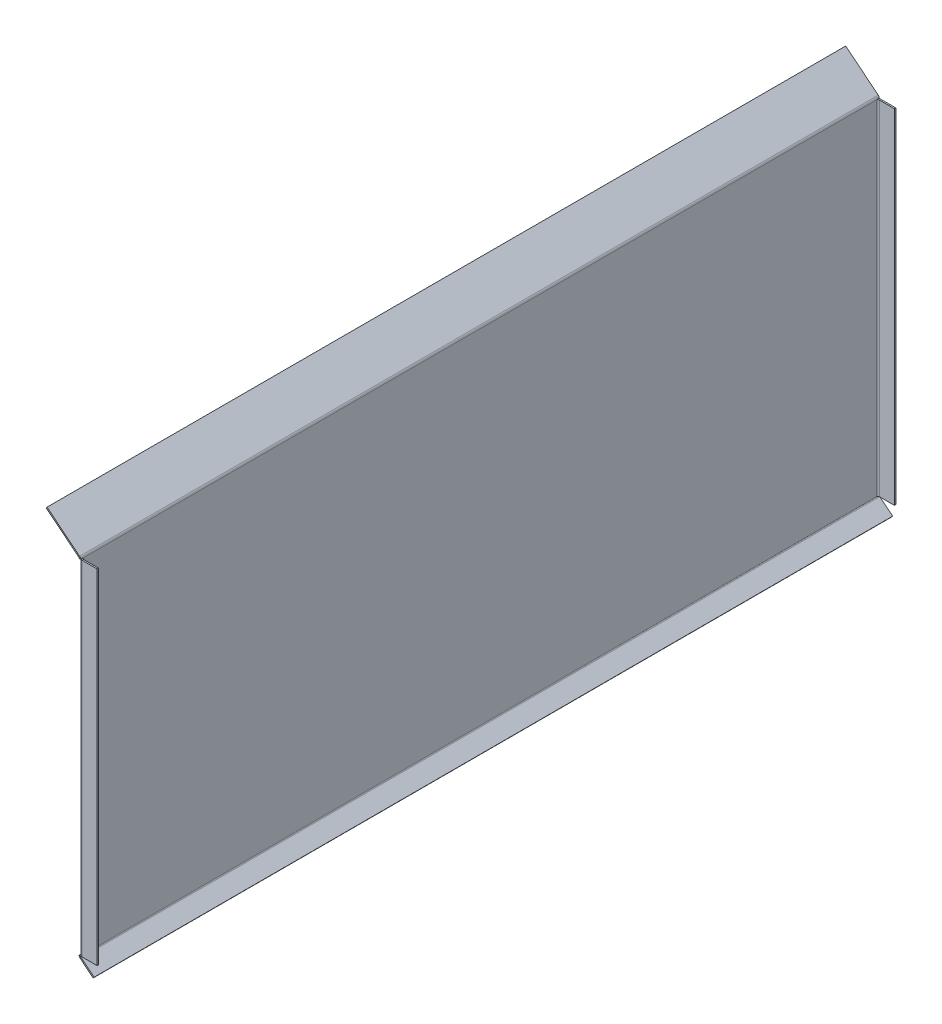
ISO-10303-21;
HEADER;
FILE_DESCRIPTION(('STEP AP214'),'2;1');
FILE_NAME('part.step','',(''),(''),'','','');
FILE_SCHEMA(('AUTOMOTIVE_DESIGN { 1 0 10303 214 1 1 1 1 }'));
ENDSEC;
DATA;
#1=APPLICATION_CONTEXT('core data for automotive mechanical design processes');
#2=APPLICATION_PROTOCOL_DEFINITION('international standard','automotive_design',2000,#1);
#3=PRODUCT_CONTEXT('',#1,'mechanical');
#4=PRODUCT('Part','Part','',(#3));
#5=PRODUCT_RELATED_PRODUCT_CATEGORY('part','',(#4));
#6=PRODUCT_DEFINITION_FORMATION('','',#4);
#7=PRODUCT_DEFINITION_CONTEXT('part definition',#1,'design');
#8=PRODUCT_DEFINITION('design','',#6,#7);
#9=PRODUCT_DEFINITION_SHAPE('','',#8);
#10=(LENGTH_UNIT() NAMED_UNIT(*) SI_UNIT(.MILLI.,.METRE.));
#11=(NAMED_UNIT(*) PLANE_ANGLE_UNIT() SI_UNIT($,.RADIAN.));
#12=(NAMED_UNIT(*) SI_UNIT($,.STERADIAN.) SOLID_ANGLE_UNIT());
#13=UNCERTAINTY_MEASURE_WITH_UNIT(LENGTH_MEASURE(1.E-05),#10,'distance_accuracy_value','');
#14=(GEOMETRIC_REPRESENTATION_CONTEXT(3) GLOBAL_UNCERTAINTY_ASSIGNED_CONTEXT((#13)) GLOBAL_UNIT_ASSIGNED_CONTEXT((#10,
#11,#12)) REPRESENTATION_CONTEXT('',''));
#15=CARTESIAN_POINT('',(0.,0.,0.));
#16=DIRECTION('',(0.,0.,1.));
#17=DIRECTION('',(1.,0.,0.));
#18=AXIS2_PLACEMENT_3D('',#15,#16,#17);
#19=CARTESIAN_POINT('',(-1.59594559789866E-13,-345.308695969271,-780.522727272728));
#20=DIRECTION('',(0.,1.,0.));
#21=DIRECTION('',(0.,0.,1.));
#22=AXIS2_PLACEMENT_3D('',#19,#20,#21);
#23=PLANE('',#22);
#24=DIRECTION('',(0.,0.,-1.));
#25=VECTOR('',#24,1.);
#26=CARTESIAN_POINT('',(-4.00000000000009,-345.308695969271,-788.522727272728));
#27=LINE('',#26,#25);
#28=CARTESIAN_POINT('',(-4.00000000000009,-345.308695969271,-788.522727272728));
#29=VERTEX_POINT('',#28);
#30=CARTESIAN_POINT('',(-4.00000000000009,-345.308695969271,-780.522727272728));
#31=VERTEX_POINT('',#30);
#32=EDGE_CURVE('E453',#29,#31,#27,.F.);
#33=ORIENTED_EDGE('',*,*,#32,.T.);
#34=CARTESIAN_POINT('',(3.99999999999984,-345.308695969271,-780.522727272728));
#35=DIRECTION('',(0.,1.,0.));
#36=DIRECTION('',(-1.,0.,0.));
#37=AXIS2_PLACEMENT_3D('',#34,#35,#36);
#38=CIRCLE('',#37,8.);
#39=CARTESIAN_POINT('',(0.,-345.308695969271,-787.450930503003));
#40=VERTEX_POINT('',#39);
#41=EDGE_CURVE('E137',#31,#40,#38,.F.);
#42=ORIENTED_EDGE('',*,*,#41,.T.);
#43=DIRECTION('',(0.,0.,-1.));
#44=VECTOR('',#43,1.);
#45=CARTESIAN_POINT('',(0.,-345.308695969271,-788.522727272728));
#46=LINE('',#45,#44);
#47=CARTESIAN_POINT('',(0.,-345.308695969271,-788.522727272728));
#48=VERTEX_POINT('',#47);
#49=EDGE_CURVE('E466',#48,#40,#46,.F.);
#50=ORIENTED_EDGE('',*,*,#49,.F.);
#51=DIRECTION('',(-1.,0.,0.));
#52=VECTOR('',#51,1.);
#53=CARTESIAN_POINT('',(0.,-345.308695969271,-788.522727272728));
#54=LINE('',#53,#52);
#55=EDGE_CURVE('E459',#48,#29,#54,.T.);
#56=ORIENTED_EDGE('',*,*,#55,.T.);
#57=EDGE_LOOP('',(#33,#42,#50,#56));
#58=FACE_BOUND('',#57,.T.);
#59=ADVANCED_FACE('F119',(#58),#23,.T.);
#60=CARTESIAN_POINT('',(0.,609.581423241998,-788.522727272728));
#61=DIRECTION('',(0.,-1.,0.));
#62=DIRECTION('',(0.,0.,-1.));
#63=AXIS2_PLACEMENT_3D('',#60,#61,#62);
#64=PLANE('',#63);
#65=DIRECTION('',(0.,0.,-1.));
#66=VECTOR('',#65,1.);
#67=CARTESIAN_POINT('',(0.,609.581423241998,-788.522727272728));
#68=LINE('',#67,#66);
#69=CARTESIAN_POINT('',(0.,609.581423241998,-788.522727272728));
#70=VERTEX_POINT('',#69);
#71=CARTESIAN_POINT('',(0.,609.581423241998,-787.450930503003));
#72=VERTEX_POINT('',#71);
#73=EDGE_CURVE('E507',#70,#72,#68,.F.);
#74=ORIENTED_EDGE('',*,*,#73,.T.);
#75=CARTESIAN_POINT('',(4.00000000000005,609.581423241998,-780.522727272728));
#76=DIRECTION('',(0.,1.,0.));
#77=DIRECTION('',(-1.,0.,0.));
#78=AXIS2_PLACEMENT_3D('',#75,#76,#77);
#79=CIRCLE('',#78,8.);
#80=CARTESIAN_POINT('',(-3.99999999999991,609.581423241998,-780.522727272728));
#81=VERTEX_POINT('',#80);
#82=EDGE_CURVE('E13',#72,#81,#79,.T.);
#83=ORIENTED_EDGE('',*,*,#82,.T.);
#84=DIRECTION('',(0.,0.,-1.));
#85=VECTOR('',#84,1.);
#86=CARTESIAN_POINT('',(-3.99999999999991,609.581423241998,-788.522727272728));
#87=LINE('',#86,#85);
#88=CARTESIAN_POINT('',(-3.99999999999991,609.581423241998,-788.522727272728));
#89=VERTEX_POINT('',#88);
#90=EDGE_CURVE('E519',#89,#81,#87,.F.);
#91=ORIENTED_EDGE('',*,*,#90,.F.);
#92=DIRECTION('',(1.,0.,0.));
#93=VECTOR('',#92,1.);
#94=CARTESIAN_POINT('',(-3.99999999999991,609.581423241998,-788.522727272728));
#95=LINE('',#94,#93);
#96=EDGE_CURVE('E123',#89,#70,#95,.T.);
#97=ORIENTED_EDGE('',*,*,#96,.T.);
#98=EDGE_LOOP('',(#74,#83,#91,#97));
#99=FACE_BOUND('',#98,.T.);
#100=ADVANCED_FACE('F533',(#99),#64,.T.);
#101=CARTESIAN_POINT('',(-4.,0.,0.));
#102=DIRECTION('',(-1.,0.,0.));
#103=DIRECTION('',(0.,0.,1.));
#104=AXIS2_PLACEMENT_3D('',#101,#102,#103);
#105=PLANE('',#104);
#106=CARTESIAN_POINT('',(-3.99999999999991,609.581423241998,1423.47727272727));
#107=VERTEX_POINT('',#106);
#108=EDGE_CURVE('E522',#81,#107,#87,.F.);
#109=ORIENTED_EDGE('',*,*,#108,.F.);
#110=DIRECTION('',(0.,1.,0.));
#111=VECTOR('',#110,1.);
#112=CARTESIAN_POINT('',(-3.99999999999995,609.581423241998,-780.522727272728));
#113=LINE('',#112,#111);
#114=EDGE_CURVE('E304',#81,#31,#113,.F.);
#115=ORIENTED_EDGE('',*,*,#114,.T.);
#116=CARTESIAN_POINT('',(-3.99999999999986,-345.308695969271,1423.47727272727));
#117=VERTEX_POINT('',#116);
#118=EDGE_CURVE('E456',#31,#117,#27,.F.);
#119=ORIENTED_EDGE('',*,*,#118,.T.);
#120=DIRECTION('',(0.,-1.,0.));
#121=VECTOR('',#120,1.);
#122=CARTESIAN_POINT('',(-4.,-345.308695969271,1423.47727272727));
#123=LINE('',#122,#121);
#124=EDGE_CURVE('E391',#117,#107,#123,.F.);
#125=ORIENTED_EDGE('',*,*,#124,.T.);
#126=EDGE_LOOP('',(#109,#115,#119,#125));
#127=FACE_BOUND('',#126,.T.);
#128=ADVANCED_FACE('F579',(#127),#105,.T.);
#129=CARTESIAN_POINT('',(0.,0.,0.));
#130=DIRECTION('',(-1.,0.,0.));
#131=DIRECTION('',(0.,0.,1.));
#132=AXIS2_PLACEMENT_3D('',#129,#130,#131);
#133=PLANE('',#132);
#134=DIRECTION('',(0.,1.,0.));
#135=VECTOR('',#134,1.);
#136=CARTESIAN_POINT('',(0.,609.581423241998,-780.522727272728));
#137=LINE('',#136,#135);
#138=CARTESIAN_POINT('',(0.,609.581423241998,-780.522727272728));
#139=VERTEX_POINT('',#138);
#140=CARTESIAN_POINT('',(0.,-345.308695969271,-780.522727272728));
#141=VERTEX_POINT('',#140);
#142=EDGE_CURVE('E355',#139,#141,#137,.F.);
#143=ORIENTED_EDGE('',*,*,#142,.F.);
#144=CARTESIAN_POINT('',(0.,609.581423241998,1423.47727272727));
#145=VERTEX_POINT('',#144);
#146=EDGE_CURVE('E510',#139,#145,#68,.F.);
#147=ORIENTED_EDGE('',*,*,#146,.T.);
#148=DIRECTION('',(0.,-1.,0.));
#149=VECTOR('',#148,1.);
#150=CARTESIAN_POINT('',(0.,-345.308695969271,1423.47727272727));
#151=LINE('',#150,#149);
#152=CARTESIAN_POINT('',(0.,-345.308695969271,1423.47727272727));
#153=VERTEX_POINT('',#152);
#154=EDGE_CURVE('E405',#153,#145,#151,.F.);
#155=ORIENTED_EDGE('',*,*,#154,.F.);
#156=EDGE_CURVE('E469',#141,#153,#46,.F.);
#157=ORIENTED_EDGE('',*,*,#156,.F.);
#158=EDGE_LOOP('',(#143,#147,#155,#157));
#159=FACE_BOUND('',#158,.T.);
#160=ADVANCED_FACE('F121',(#159),#133,.F.);
#161=CARTESIAN_POINT('',(1.43114686768087E-13,-345.308695969271,1431.47727272727));
#162=DIRECTION('',(0.,1.,0.));
#163=DIRECTION('',(0.,0.,1.));
#164=AXIS2_PLACEMENT_3D('',#161,#162,#163);
#165=PLANE('',#164);
#166=DIRECTION('',(0.,0.,-1.));
#167=VECTOR('',#166,1.);
#168=CARTESIAN_POINT('',(1.43114686768087E-13,-345.308695969271,1431.47727272727));
#169=LINE('',#168,#167);
#170=CARTESIAN_POINT('',(1.43114686768087E-13,-345.308695969271,1431.47727272727));
#171=VERTEX_POINT('',#170);
#172=CARTESIAN_POINT('',(1.23940954395816E-13,-345.308695969271,1430.40547595755));
#173=VERTEX_POINT('',#172);
#174=EDGE_CURVE('E410',#171,#173,#169,.T.);
#175=ORIENTED_EDGE('',*,*,#174,.T.);
#176=CARTESIAN_POINT('',(4.,-345.308695969271,1423.47727272727));
#177=DIRECTION('',(0.,-1.,0.));
#178=DIRECTION('',(0.,0.,-1.));
#179=AXIS2_PLACEMENT_3D('',#176,#177,#178);
#180=CIRCLE('',#179,8.);
#181=EDGE_CURVE('E128',#173,#117,#180,.T.);
#182=ORIENTED_EDGE('',*,*,#181,.T.);
#183=DIRECTION('',(0.,0.,-1.));
#184=VECTOR('',#183,1.);
#185=CARTESIAN_POINT('',(-4.00000000000009,-345.308695969271,-788.522727272728));
#186=LINE('',#185,#184);
#187=CARTESIAN_POINT('',(-3.99999999999986,-345.308695969271,1431.47727272727));
#188=VERTEX_POINT('',#187);
#189=EDGE_CURVE('E413',#188,#117,#186,.T.);
#190=ORIENTED_EDGE('',*,*,#189,.F.);
#191=DIRECTION('',(-1.,0.,0.));
#192=VECTOR('',#191,1.);
#193=CARTESIAN_POINT('',(1.43114686768087E-13,-345.308695969271,1431.47727272727));
#194=LINE('',#193,#192);
#195=EDGE_CURVE('E472',#171,#188,#194,.T.);
#196=ORIENTED_EDGE('',*,*,#195,.F.);
#197=EDGE_LOOP('',(#175,#182,#190,#196));
#198=FACE_BOUND('',#197,.T.);
#199=ADVANCED_FACE('F625',(#198),#165,.T.);
#200=CARTESIAN_POINT('',(0.,609.581423241998,1423.47727272727));
#201=DIRECTION('',(0.,-1.,0.));
#202=DIRECTION('',(0.,0.,-1.));
#203=AXIS2_PLACEMENT_3D('',#200,#201,#202);
#204=PLANE('',#203);
#205=CARTESIAN_POINT('',(-3.99999999999991,609.581423241998,1431.47727272727));
#206=VERTEX_POINT('',#205);
#207=EDGE_CURVE('E523',#107,#206,#87,.F.);
#208=ORIENTED_EDGE('',*,*,#207,.F.);
#209=CARTESIAN_POINT('',(4.,609.581423241998,1423.47727272727));
#210=DIRECTION('',(0.,-1.,0.));
#211=DIRECTION('',(0.,0.,-1.));
#212=AXIS2_PLACEMENT_3D('',#209,#210,#211);
#213=CIRCLE('',#212,8.);
#214=CARTESIAN_POINT('',(0.,609.581423241998,1430.40547595755));
#215=VERTEX_POINT('',#214);
#216=EDGE_CURVE('E396',#107,#215,#213,.F.);
#217=ORIENTED_EDGE('',*,*,#216,.T.);
#218=DIRECTION('',(0.,0.,1.));
#219=VECTOR('',#218,1.);
#220=CARTESIAN_POINT('',(0.,609.581423241998,1423.47727272727));
#221=LINE('',#220,#219);
#222=CARTESIAN_POINT('',(0.,609.581423241998,1431.47727272727));
#223=VERTEX_POINT('',#222);
#224=EDGE_CURVE('E399',#215,#223,#221,.T.);
#225=ORIENTED_EDGE('',*,*,#224,.T.);
#226=DIRECTION('',(1.,0.,0.));
#227=VECTOR('',#226,1.);
#228=CARTESIAN_POINT('',(-3.99999999999991,609.581423241998,1431.47727272727));
#229=LINE('',#228,#227);
#230=EDGE_CURVE('E525',#206,#223,#229,.T.);
#231=ORIENTED_EDGE('',*,*,#230,.F.);
#232=EDGE_LOOP('',(#208,#217,#225,#231));
#233=FACE_BOUND('',#232,.T.);
#234=ADVANCED_FACE('F622',(#233),#204,.T.);
#235=CARTESIAN_POINT('',(-7.99999999999983,609.581423241998,1431.47727272727));
#236=DIRECTION('',(0.,0.,1.));
#237=DIRECTION('',(1.,0.,0.));
#238=AXIS2_PLACEMENT_3D('',#235,#236,#237);
#239=PLANE('',#238);
#240=DIRECTION('',(-0.629320391049841,-0.777145961456968,0.));
#241=VECTOR('',#240,1.);
#242=CARTESIAN_POINT('',(-2.96543687160124,615.798590933654,1431.47727272727));
#243=LINE('',#242,#241);
#244=CARTESIAN_POINT('',(-5.48271843580051,612.690007087826,1431.47727272727));
#245=VERTEX_POINT('',#244);
#246=CARTESIAN_POINT('',(-2.96543687160113,615.798590933654,1431.47727272727));
#247=VERTEX_POINT('',#246);
#248=EDGE_CURVE('E475',#245,#247,#243,.F.);
#249=ORIENTED_EDGE('',*,*,#248,.F.);
#250=CARTESIAN_POINT('',(-7.99999999999983,609.581423241998,1431.47727272727));
#251=DIRECTION('',(0.,0.,-1.));
#252=DIRECTION('',(-1.,0.,0.));
#253=AXIS2_PLACEMENT_3D('',#250,#251,#252);
#254=CIRCLE('',#253,3.99999999999993);
#255=EDGE_CURVE('E516',#206,#245,#254,.F.);
#256=ORIENTED_EDGE('',*,*,#255,.F.);
#257=ORIENTED_EDGE('',*,*,#230,.T.);
#258=CARTESIAN_POINT('',(-7.99999999999983,609.581423241998,1431.47727272727));
#259=DIRECTION('',(0.,0.,-1.));
#260=DIRECTION('',(-1.,0.,0.));
#261=AXIS2_PLACEMENT_3D('',#258,#259,#260);
#262=CIRCLE('',#261,7.99999999999993);
#263=EDGE_CURVE('E509',#223,#247,#262,.F.);
#264=ORIENTED_EDGE('',*,*,#263,.T.);
#265=EDGE_LOOP('',(#249,#256,#257,#264));
#266=FACE_BOUND('',#265,.T.);
#267=ADVANCED_FACE('F556',(#266),#239,.T.);
#268=CARTESIAN_POINT('',(-7.99999999999983,609.581423241998,-788.522727272728));
#269=DIRECTION('',(0.,0.,1.));
#270=DIRECTION('',(1.,0.,0.));
#271=AXIS2_PLACEMENT_3D('',#268,#269,#270);
#272=PLANE('',#271);
#273=CARTESIAN_POINT('',(-7.99999999999983,609.581423241998,-788.522727272728));
#274=DIRECTION('',(0.,0.,-1.));
#275=DIRECTION('',(-1.,0.,0.));
#276=AXIS2_PLACEMENT_3D('',#273,#274,#275);
#277=CIRCLE('',#276,3.99999999999993);
#278=CARTESIAN_POINT('',(-5.48271843580051,612.690007087826,-788.522727272728));
#279=VERTEX_POINT('',#278);
#280=EDGE_CURVE('E480',#279,#89,#277,.T.);
#281=ORIENTED_EDGE('',*,*,#280,.F.);
#282=DIRECTION('',(-0.629320391049841,-0.777145961456968,0.));
#283=VECTOR('',#282,1.);
#284=CARTESIAN_POINT('',(-5.48271843580046,612.690007087826,-788.522727272728));
#285=LINE('',#284,#283);
#286=CARTESIAN_POINT('',(-2.96543687160105,615.798590933654,-788.522727272728));
#287=VERTEX_POINT('',#286);
#288=EDGE_CURVE('E500',#279,#287,#285,.F.);
#289=ORIENTED_EDGE('',*,*,#288,.T.);
#290=CARTESIAN_POINT('',(-7.99999999999983,609.581423241998,-788.522727272728));
#291=DIRECTION('',(0.,0.,-1.));
#292=DIRECTION('',(-1.,0.,0.));
#293=AXIS2_PLACEMENT_3D('',#290,#291,#292);
#294=CIRCLE('',#293,7.99999999999993);
#295=EDGE_CURVE('E513',#287,#70,#294,.T.);
#296=ORIENTED_EDGE('',*,*,#295,.T.);
#297=ORIENTED_EDGE('',*,*,#96,.F.);
#298=EDGE_LOOP('',(#281,#289,#296,#297));
#299=FACE_BOUND('',#298,.T.);
#300=ADVANCED_FACE('F537',(#299),#272,.F.);
#301=CARTESIAN_POINT('',(-7.99999999999983,609.581423241998,-788.522727272728));
#302=DIRECTION('',(0.,0.,-1.));
#303=DIRECTION('',(0.629320391049841,0.777145961456968,0.));
#304=AXIS2_PLACEMENT_3D('',#301,#302,#303);
#305=CYLINDRICAL_SURFACE('',#304,7.99999999999993);
#306=ORIENTED_EDGE('',*,*,#73,.F.);
#307=ORIENTED_EDGE('',*,*,#295,.F.);
#308=DIRECTION('',(0.,0.,-1.));
#309=VECTOR('',#308,1.);
#310=CARTESIAN_POINT('',(-2.96543687160127,615.798590933654,1431.47727272727));
#311=LINE('',#310,#309);
#312=EDGE_CURVE('E498',#287,#247,#311,.F.);
#313=ORIENTED_EDGE('',*,*,#312,.T.);
#314=ORIENTED_EDGE('',*,*,#263,.F.);
#315=ORIENTED_EDGE('',*,*,#224,.F.);
#316=EDGE_CURVE('E415',#145,#215,#221,.T.);
#317=ORIENTED_EDGE('',*,*,#316,.F.);
#318=ORIENTED_EDGE('',*,*,#146,.F.);
#319=EDGE_CURVE('E145',#72,#139,#68,.F.);
#320=ORIENTED_EDGE('',*,*,#319,.F.);
#321=EDGE_LOOP('',(#306,#307,#313,#314,#315,#317,#318,#320));
#322=FACE_BOUND('',#321,.T.);
#323=ADVANCED_FACE('F536',(#322),#305,.T.);
#324=CARTESIAN_POINT('',(-7.99999999999983,609.581423241998,-788.522727272728));
#325=DIRECTION('',(0.,0.,-1.));
#326=DIRECTION('',(0.629320391049841,0.777145961456968,0.));
#327=AXIS2_PLACEMENT_3D('',#324,#325,#326);
#328=CYLINDRICAL_SURFACE('',#327,3.99999999999993);
#329=ORIENTED_EDGE('',*,*,#90,.T.);
#330=ORIENTED_EDGE('',*,*,#108,.T.);
#331=ORIENTED_EDGE('',*,*,#207,.T.);
#332=ORIENTED_EDGE('',*,*,#255,.T.);
#333=DIRECTION('',(0.,0.,-1.));
#334=VECTOR('',#333,1.);
#335=CARTESIAN_POINT('',(-5.48271843580064,612.690007087826,1431.47727272727));
#336=LINE('',#335,#334);
#337=EDGE_CURVE('E503',#245,#279,#336,.T.);
#338=ORIENTED_EDGE('',*,*,#337,.T.);
#339=ORIENTED_EDGE('',*,*,#280,.T.);
#340=EDGE_LOOP('',(#329,#330,#331,#332,#338,#339));
#341=FACE_BOUND('',#340,.T.);
#342=ADVANCED_FACE('F560',(#341),#328,.F.);
#343=CARTESIAN_POINT('',(-93.2575153748361,688.915674429565,-788.522727272728));
#344=DIRECTION('',(0.,0.,1.));
#345=DIRECTION('',(1.,0.,0.));
#346=AXIS2_PLACEMENT_3D('',#343,#344,#345);
#347=PLANE('',#346);
#348=ORIENTED_EDGE('',*,*,#288,.F.);
#349=DIRECTION('',(0.777145961456968,-0.629320391049841,0.));
#350=VECTOR('',#349,1.);
#351=CARTESIAN_POINT('',(-95.7747969390355,685.807090583737,-788.522727272728));
#352=LINE('',#351,#350);
#353=CARTESIAN_POINT('',(-95.7747969390355,685.807090583737,-788.522727272728));
#354=VERTEX_POINT('',#353);
#355=EDGE_CURVE('E496',#279,#354,#352,.F.);
#356=ORIENTED_EDGE('',*,*,#355,.T.);
#357=DIRECTION('',(-0.629320391049841,-0.777145961456968,0.));
#358=VECTOR('',#357,1.);
#359=CARTESIAN_POINT('',(-93.2575153748361,688.915674429565,-788.522727272728));
#360=LINE('',#359,#358);
#361=CARTESIAN_POINT('',(-93.2575153748361,688.915674429565,-788.522727272728));
#362=VERTEX_POINT('',#361);
#363=EDGE_CURVE('E477',#362,#354,#360,.T.);
#364=ORIENTED_EDGE('',*,*,#363,.F.);
#365=DIRECTION('',(-0.777145961456968,0.629320391049841,0.));
#366=VECTOR('',#365,1.);
#367=CARTESIAN_POINT('',(302.513794753899,368.426386690642,-788.522727272728));
#368=LINE('',#367,#366);
#369=EDGE_CURVE('E489',#287,#362,#368,.T.);
#370=ORIENTED_EDGE('',*,*,#369,.F.);
#371=EDGE_LOOP('',(#348,#356,#364,#370));
#372=FACE_BOUND('',#371,.T.);
#373=ADVANCED_FACE('F547',(#372),#347,.F.);
#374=CARTESIAN_POINT('',(-1.48271843580064,614.597909218619,1431.47727272727));
#375=DIRECTION('',(0.,0.,-1.));
#376=DIRECTION('',(-1.,0.,0.));
#377=AXIS2_PLACEMENT_3D('',#374,#375,#376);
#378=PLANE('',#377);
#379=ORIENTED_EDGE('',*,*,#248,.T.);
#380=DIRECTION('',(0.777145961456968,-0.629320391049841,0.));
#381=VECTOR('',#380,1.);
#382=CARTESIAN_POINT('',(302.513794753899,368.426386690642,1431.47727272727));
#383=LINE('',#382,#381);
#384=CARTESIAN_POINT('',(-93.2575153748361,688.915674429565,1431.47727272727));
#385=VERTEX_POINT('',#384);
#386=EDGE_CURVE('E484',#385,#247,#383,.T.);
#387=ORIENTED_EDGE('',*,*,#386,.F.);
#388=DIRECTION('',(-0.629320391049841,-0.777145961456968,0.));
#389=VECTOR('',#388,1.);
#390=CARTESIAN_POINT('',(-93.2575153748361,688.915674429565,1431.47727272727));
#391=LINE('',#390,#389);
#392=CARTESIAN_POINT('',(-95.7747969390355,685.807090583737,1431.47727272727));
#393=VERTEX_POINT('',#392);
#394=EDGE_CURVE('E481',#385,#393,#391,.T.);
#395=ORIENTED_EDGE('',*,*,#394,.T.);
#396=DIRECTION('',(-0.777145961456968,0.629320391049841,0.));
#397=VECTOR('',#396,1.);
#398=CARTESIAN_POINT('',(-4.00000000000004,611.489325372791,1431.47727272727));
#399=LINE('',#398,#397);
#400=EDGE_CURVE('E491',#393,#245,#399,.F.);
#401=ORIENTED_EDGE('',*,*,#400,.T.);
#402=EDGE_LOOP('',(#379,#387,#395,#401));
#403=FACE_BOUND('',#402,.T.);
#404=ADVANCED_FACE('F555',(#403),#378,.F.);
#405=CARTESIAN_POINT('',(302.513794753899,368.426386690642,0.));
#406=DIRECTION('',(-0.629320391049841,-0.777145961456968,0.));
#407=DIRECTION('',(0.777145961456968,-0.629320391049841,0.));
#408=AXIS2_PLACEMENT_3D('',#405,#406,#407);
#409=PLANE('',#408);
#410=ORIENTED_EDGE('',*,*,#312,.F.);
#411=ORIENTED_EDGE('',*,*,#369,.T.);
#412=DIRECTION('',(0.,0.,1.));
#413=VECTOR('',#412,1.);
#414=CARTESIAN_POINT('',(-93.2575153748361,688.915674429564,0.));
#415=LINE('',#414,#413);
#416=EDGE_CURVE('E487',#362,#385,#415,.T.);
#417=ORIENTED_EDGE('',*,*,#416,.T.);
#418=ORIENTED_EDGE('',*,*,#386,.T.);
#419=EDGE_LOOP('',(#410,#411,#417,#418));
#420=FACE_BOUND('',#419,.T.);
#421=ADVANCED_FACE('F544',(#420),#409,.F.);
#422=CARTESIAN_POINT('',(299.9965131897,365.317802844814,0.));
#423=DIRECTION('',(-0.629320391049841,-0.777145961456968,0.));
#424=DIRECTION('',(0.777145961456968,-0.629320391049841,0.));
#425=AXIS2_PLACEMENT_3D('',#422,#423,#424);
#426=PLANE('',#425);
#427=ORIENTED_EDGE('',*,*,#355,.F.);
#428=ORIENTED_EDGE('',*,*,#337,.F.);
#429=ORIENTED_EDGE('',*,*,#400,.F.);
#430=DIRECTION('',(0.,0.,-1.));
#431=VECTOR('',#430,1.);
#432=CARTESIAN_POINT('',(-95.7747969390355,685.807090583737,1431.47727272727));
#433=LINE('',#432,#431);
#434=EDGE_CURVE('E494',#354,#393,#433,.F.);
#435=ORIENTED_EDGE('',*,*,#434,.F.);
#436=EDGE_LOOP('',(#427,#428,#429,#435));
#437=FACE_BOUND('',#436,.T.);
#438=ADVANCED_FACE('F563',(#437),#426,.T.);
#439=CARTESIAN_POINT('',(-93.2575153748361,688.915674429565,1431.47727272727));
#440=DIRECTION('',(0.777145961456968,-0.629320391049841,0.));
#441=DIRECTION('',(0.629320391049841,0.777145961456968,0.));
#442=AXIS2_PLACEMENT_3D('',#439,#440,#441);
#443=PLANE('',#442);
#444=ORIENTED_EDGE('',*,*,#434,.T.);
#445=ORIENTED_EDGE('',*,*,#394,.F.);
#446=ORIENTED_EDGE('',*,*,#416,.F.);
#447=ORIENTED_EDGE('',*,*,#363,.T.);
#448=EDGE_LOOP('',(#444,#445,#446,#447));
#449=FACE_BOUND('',#448,.T.);
#450=ADVANCED_FACE('F552',(#449),#443,.F.);
#451=CARTESIAN_POINT('',(4.00000000000023,-345.308695969271,1431.47727272727));
#452=DIRECTION('',(0.,0.,1.));
#453=DIRECTION('',(1.,0.,0.));
#454=AXIS2_PLACEMENT_3D('',#451,#452,#453);
#455=PLANE('',#454);
#456=DIRECTION('',(-0.629320391049841,-0.777145961456968,0.));
#457=VECTOR('',#456,1.);
#458=CARTESIAN_POINT('',(-1.03456312839863,-351.525863660927,1431.47727272727));
#459=LINE('',#458,#457);
#460=CARTESIAN_POINT('',(1.48271843580081,-348.417279815099,1431.47727272727));
#461=VERTEX_POINT('',#460);
#462=CARTESIAN_POINT('',(-1.03456312839854,-351.525863660927,1431.47727272727));
#463=VERTEX_POINT('',#462);
#464=EDGE_CURVE('E420',#461,#463,#459,.T.);
#465=ORIENTED_EDGE('',*,*,#464,.F.);
#466=CARTESIAN_POINT('',(4.00000000000023,-345.308695969271,1431.47727272727));
#467=DIRECTION('',(0.,0.,-1.));
#468=DIRECTION('',(-1.,0.,0.));
#469=AXIS2_PLACEMENT_3D('',#466,#467,#468);
#470=CIRCLE('',#469,4.00000000000009);
#471=EDGE_CURVE('E463',#171,#461,#470,.F.);
#472=ORIENTED_EDGE('',*,*,#471,.F.);
#473=ORIENTED_EDGE('',*,*,#195,.T.);
#474=CARTESIAN_POINT('',(4.00000000000023,-345.308695969271,1431.47727272727));
#475=DIRECTION('',(0.,0.,-1.));
#476=DIRECTION('',(-1.,0.,0.));
#477=AXIS2_PLACEMENT_3D('',#474,#475,#476);
#478=CIRCLE('',#477,8.00000000000009);
#479=EDGE_CURVE('E455',#188,#463,#478,.F.);
#480=ORIENTED_EDGE('',*,*,#479,.T.);
#481=EDGE_LOOP('',(#465,#472,#473,#480));
#482=FACE_BOUND('',#481,.T.);
#483=ADVANCED_FACE('F570',(#482),#455,.T.);
#484=CARTESIAN_POINT('',(4.,-345.308695969271,-788.522727272728));
#485=DIRECTION('',(0.,0.,1.));
#486=DIRECTION('',(1.,0.,0.));
#487=AXIS2_PLACEMENT_3D('',#484,#485,#486);
#488=PLANE('',#487);
#489=CARTESIAN_POINT('',(4.,-345.308695969271,-788.522727272728));
#490=DIRECTION('',(0.,0.,-1.));
#491=DIRECTION('',(-1.,0.,0.));
#492=AXIS2_PLACEMENT_3D('',#489,#490,#491);
#493=CIRCLE('',#492,4.00000000000009);
#494=CARTESIAN_POINT('',(1.48271843580058,-348.417279815099,-788.522727272728));
#495=VERTEX_POINT('',#494);
#496=EDGE_CURVE('E423',#495,#48,#493,.T.);
#497=ORIENTED_EDGE('',*,*,#496,.F.);
#498=DIRECTION('',(-0.629320391049841,-0.777145961456968,0.));
#499=VECTOR('',#498,1.);
#500=CARTESIAN_POINT('',(1.48271843580076,-348.417279815099,-788.522727272728));
#501=LINE('',#500,#499);
#502=CARTESIAN_POINT('',(-1.03456312839863,-351.525863660927,-788.522727272728));
#503=VERTEX_POINT('',#502);
#504=EDGE_CURVE('E446',#495,#503,#501,.T.);
#505=ORIENTED_EDGE('',*,*,#504,.T.);
#506=CARTESIAN_POINT('',(4.,-345.308695969271,-788.522727272728));
#507=DIRECTION('',(0.,0.,-1.));
#508=DIRECTION('',(-1.,0.,0.));
#509=AXIS2_PLACEMENT_3D('',#506,#507,#508);
#510=CIRCLE('',#509,8.00000000000009);
#511=EDGE_CURVE('E460',#503,#29,#510,.T.);
#512=ORIENTED_EDGE('',*,*,#511,.T.);
#513=ORIENTED_EDGE('',*,*,#55,.F.);
#514=EDGE_LOOP('',(#497,#505,#512,#513));
#515=FACE_BOUND('',#514,.T.);
#516=ADVANCED_FACE('F653',(#515),#488,.F.);
#517=CARTESIAN_POINT('',(4.,-345.308695969271,-788.522727272728));
#518=DIRECTION('',(0.,0.,-1.));
#519=DIRECTION('',(-0.629320391049841,-0.777145961456968,0.));
#520=AXIS2_PLACEMENT_3D('',#517,#518,#519);
#521=CYLINDRICAL_SURFACE('',#520,8.00000000000009);
#522=ORIENTED_EDGE('',*,*,#32,.F.);
#523=ORIENTED_EDGE('',*,*,#511,.F.);
#524=DIRECTION('',(0.,0.,-1.));
#525=VECTOR('',#524,1.);
#526=CARTESIAN_POINT('',(-1.03456312839861,-351.525863660927,0.));
#527=LINE('',#526,#525);
#528=EDGE_CURVE('E443',#463,#503,#527,.T.);
#529=ORIENTED_EDGE('',*,*,#528,.F.);
#530=ORIENTED_EDGE('',*,*,#479,.F.);
#531=ORIENTED_EDGE('',*,*,#189,.T.);
#532=ORIENTED_EDGE('',*,*,#118,.F.);
#533=EDGE_LOOP('',(#522,#523,#529,#530,#531,#532));
#534=FACE_BOUND('',#533,.T.);
#535=ADVANCED_FACE('F650',(#534),#521,.T.);
#536=CARTESIAN_POINT('',(4.,-345.308695969271,-788.522727272728));
#537=DIRECTION('',(0.,0.,-1.));
#538=DIRECTION('',(-0.629320391049841,-0.777145961456968,0.));
#539=AXIS2_PLACEMENT_3D('',#536,#537,#538);
#540=CYLINDRICAL_SURFACE('',#539,4.00000000000009);
#541=ORIENTED_EDGE('',*,*,#49,.T.);
#542=EDGE_CURVE('E468',#40,#141,#46,.F.);
#543=ORIENTED_EDGE('',*,*,#542,.T.);
#544=ORIENTED_EDGE('',*,*,#156,.T.);
#545=EDGE_CURVE('E414',#173,#153,#169,.T.);
#546=ORIENTED_EDGE('',*,*,#545,.F.);
#547=ORIENTED_EDGE('',*,*,#174,.F.);
#548=ORIENTED_EDGE('',*,*,#471,.T.);
#549=DIRECTION('',(0.,0.,1.));
#550=VECTOR('',#549,1.);
#551=CARTESIAN_POINT('',(1.48271843580071,-348.417279815099,1431.47727272727));
#552=LINE('',#551,#550);
#553=EDGE_CURVE('E449',#461,#495,#552,.F.);
#554=ORIENTED_EDGE('',*,*,#553,.T.);
#555=ORIENTED_EDGE('',*,*,#496,.T.);
#556=EDGE_LOOP('',(#541,#543,#544,#546,#547,#548,#554,#555));
#557=FACE_BOUND('',#556,.T.);
#558=ADVANCED_FACE('F642',(#557),#540,.F.);
#559=CARTESIAN_POINT('',(-2.51728156419934,-350.325181945891,-788.522727272728));
#560=DIRECTION('',(0.,0.,-1.));
#561=DIRECTION('',(0.,1.,0.));
#562=AXIS2_PLACEMENT_3D('',#559,#560,#561);
#563=PLANE('',#562);
#564=DIRECTION('',(-0.777145961456968,0.629320391049841,0.));
#565=VECTOR('',#564,1.);
#566=CARTESIAN_POINT('',(-2.51728156419937,-350.325181945892,-788.522727272728));
#567=LINE('',#566,#565);
#568=CARTESIAN_POINT('',(34.8572980728484,-380.590519783348,-788.522727272728));
#569=VERTEX_POINT('',#568);
#570=EDGE_CURVE('E427',#569,#503,#567,.T.);
#571=ORIENTED_EDGE('',*,*,#570,.T.);
#572=ORIENTED_EDGE('',*,*,#504,.F.);
#573=DIRECTION('',(0.777145961456968,-0.629320391049841,0.));
#574=VECTOR('',#573,1.);
#575=CARTESIAN_POINT('',(-172.331822747465,-207.665039627773,-788.522727272728));
#576=LINE('',#575,#574);
#577=CARTESIAN_POINT('',(37.3745796370478,-377.48193593752,-788.522727272728));
#578=VERTEX_POINT('',#577);
#579=EDGE_CURVE('E435',#578,#495,#576,.F.);
#580=ORIENTED_EDGE('',*,*,#579,.F.);
#581=DIRECTION('',(0.629320391049841,0.777145961456968,0.));
#582=VECTOR('',#581,1.);
#583=CARTESIAN_POINT('',(34.8572980728484,-380.590519783348,-788.522727272728));
#584=LINE('',#583,#582);
#585=EDGE_CURVE('E421',#569,#578,#584,.T.);
#586=ORIENTED_EDGE('',*,*,#585,.F.);
#587=EDGE_LOOP('',(#571,#572,#580,#586));
#588=FACE_BOUND('',#587,.T.);
#589=ADVANCED_FACE('F639',(#588),#563,.T.);
#590=CARTESIAN_POINT('',(34.8572980728484,-380.590519783348,1431.47727272727));
#591=DIRECTION('',(0.,0.,1.));
#592=DIRECTION('',(0.,-1.,0.));
#593=AXIS2_PLACEMENT_3D('',#590,#591,#592);
#594=PLANE('',#593);
#595=DIRECTION('',(-0.777145961456968,0.629320391049841,0.));
#596=VECTOR('',#595,1.);
#597=CARTESIAN_POINT('',(-172.331822747465,-207.665039627773,1431.47727272727));
#598=LINE('',#597,#596);
#599=CARTESIAN_POINT('',(37.3745796370478,-377.48193593752,1431.47727272727));
#600=VERTEX_POINT('',#599);
#601=EDGE_CURVE('E441',#461,#600,#598,.F.);
#602=ORIENTED_EDGE('',*,*,#601,.F.);
#603=ORIENTED_EDGE('',*,*,#464,.T.);
#604=DIRECTION('',(0.777145961456968,-0.629320391049841,0.));
#605=VECTOR('',#604,1.);
#606=CARTESIAN_POINT('',(34.8572980728484,-380.590519783348,1431.47727272727));
#607=LINE('',#606,#605);
#608=CARTESIAN_POINT('',(34.8572980728484,-380.590519783348,1431.47727272727));
#609=VERTEX_POINT('',#608);
#610=EDGE_CURVE('E433',#463,#609,#607,.T.);
#611=ORIENTED_EDGE('',*,*,#610,.T.);
#612=DIRECTION('',(0.629320391049841,0.777145961456968,0.));
#613=VECTOR('',#612,1.);
#614=CARTESIAN_POINT('',(34.8572980728484,-380.590519783348,1431.47727272727));
#615=LINE('',#614,#613);
#616=EDGE_CURVE('E424',#609,#600,#615,.T.);
#617=ORIENTED_EDGE('',*,*,#616,.T.);
#618=EDGE_LOOP('',(#602,#603,#611,#617));
#619=FACE_BOUND('',#618,.T.);
#620=ADVANCED_FACE('F634',(#619),#594,.T.);
#621=CARTESIAN_POINT('',(-174.849104311665,-210.7736234736,0.));
#622=DIRECTION('',(-0.629320391049841,-0.777145961456968,0.));
#623=DIRECTION('',(0.777145961456968,-0.629320391049841,0.));
#624=AXIS2_PLACEMENT_3D('',#621,#622,#623);
#625=PLANE('',#624);
#626=ORIENTED_EDGE('',*,*,#610,.F.);
#627=ORIENTED_EDGE('',*,*,#528,.T.);
#628=ORIENTED_EDGE('',*,*,#570,.F.);
#629=DIRECTION('',(0.,0.,-1.));
#630=VECTOR('',#629,1.);
#631=CARTESIAN_POINT('',(34.8572980728484,-380.590519783348,-788.522727272728));
#632=LINE('',#631,#630);
#633=EDGE_CURVE('E430',#609,#569,#632,.T.);
#634=ORIENTED_EDGE('',*,*,#633,.F.);
#635=EDGE_LOOP('',(#626,#627,#628,#634));
#636=FACE_BOUND('',#635,.T.);
#637=ADVANCED_FACE('F630',(#636),#625,.T.);
#638=CARTESIAN_POINT('',(-172.331822747465,-207.665039627773,0.));
#639=DIRECTION('',(-0.629320391049841,-0.777145961456968,0.));
#640=DIRECTION('',(0.777145961456968,-0.629320391049841,0.));
#641=AXIS2_PLACEMENT_3D('',#638,#639,#640);
#642=PLANE('',#641);
#643=ORIENTED_EDGE('',*,*,#553,.F.);
#644=ORIENTED_EDGE('',*,*,#601,.T.);
#645=DIRECTION('',(0.,0.,1.));
#646=VECTOR('',#645,1.);
#647=CARTESIAN_POINT('',(37.3745796370478,-377.48193593752,0.));
#648=LINE('',#647,#646);
#649=EDGE_CURVE('E438',#600,#578,#648,.F.);
#650=ORIENTED_EDGE('',*,*,#649,.T.);
#651=ORIENTED_EDGE('',*,*,#579,.T.);
#652=EDGE_LOOP('',(#643,#644,#650,#651));
#653=FACE_BOUND('',#652,.T.);
#654=ADVANCED_FACE('F633',(#653),#642,.F.);
#655=CARTESIAN_POINT('',(34.8572980728484,-380.590519783348,-788.522727272728));
#656=DIRECTION('',(0.777145961456968,-0.629320391049841,0.));
#657=DIRECTION('',(0.629320391049841,0.777145961456968,0.));
#658=AXIS2_PLACEMENT_3D('',#655,#656,#657);
#659=PLANE('',#658);
#660=ORIENTED_EDGE('',*,*,#649,.F.);
#661=ORIENTED_EDGE('',*,*,#616,.F.);
#662=ORIENTED_EDGE('',*,*,#633,.T.);
#663=ORIENTED_EDGE('',*,*,#585,.T.);
#664=EDGE_LOOP('',(#660,#661,#662,#663));
#665=FACE_BOUND('',#664,.T.);
#666=ADVANCED_FACE('F617',(#665),#659,.T.);
#667=CARTESIAN_POINT('',(4.,609.581423241998,1423.47727272727));
#668=DIRECTION('',(0.,1.,0.));
#669=DIRECTION('',(0.,0.,1.));
#670=AXIS2_PLACEMENT_3D('',#667,#668,#669);
#671=PLANE('',#670);
#672=CARTESIAN_POINT('',(4.,609.581423241998,1423.47727272727));
#673=DIRECTION('',(0.,-1.,0.));
#674=DIRECTION('',(0.,0.,-1.));
#675=AXIS2_PLACEMENT_3D('',#672,#673,#674);
#676=CIRCLE('',#675,4.);
#677=CARTESIAN_POINT('',(3.99999999999998,609.581423241998,1427.47727272727));
#678=VERTEX_POINT('',#677);
#679=EDGE_CURVE('E402',#145,#678,#676,.F.);
#680=ORIENTED_EDGE('',*,*,#679,.F.);
#681=ORIENTED_EDGE('',*,*,#316,.T.);
#682=CARTESIAN_POINT('',(3.99999999999996,609.581423241998,1431.47727272727));
#683=VERTEX_POINT('',#682);
#684=EDGE_CURVE('E394',#215,#683,#213,.F.);
#685=ORIENTED_EDGE('',*,*,#684,.T.);
#686=DIRECTION('',(0.,0.,1.));
#687=VECTOR('',#686,1.);
#688=CARTESIAN_POINT('',(4.,609.581423241998,1431.47727272727));
#689=LINE('',#688,#687);
#690=EDGE_CURVE('E351',#678,#683,#689,.T.);
#691=ORIENTED_EDGE('',*,*,#690,.F.);
#692=EDGE_LOOP('',(#680,#681,#685,#691));
#693=FACE_BOUND('',#692,.T.);
#694=ADVANCED_FACE('F614',(#693),#671,.T.);
#695=CARTESIAN_POINT('',(4.,-345.308695969271,1423.47727272727));
#696=DIRECTION('',(0.,1.,0.));
#697=DIRECTION('',(0.,0.,1.));
#698=AXIS2_PLACEMENT_3D('',#695,#696,#697);
#699=PLANE('',#698);
#700=CARTESIAN_POINT('',(4.,-345.308695969271,1431.47727272727));
#701=VERTEX_POINT('',#700);
#702=EDGE_CURVE('E395',#701,#173,#180,.T.);
#703=ORIENTED_EDGE('',*,*,#702,.T.);
#704=ORIENTED_EDGE('',*,*,#545,.T.);
#705=CARTESIAN_POINT('',(4.,-345.308695969271,1423.47727272727));
#706=DIRECTION('',(0.,-1.,0.));
#707=DIRECTION('',(0.,0.,-1.));
#708=AXIS2_PLACEMENT_3D('',#705,#706,#707);
#709=CIRCLE('',#708,4.);
#710=CARTESIAN_POINT('',(3.99999999999998,-345.308695969271,1427.47727272727));
#711=VERTEX_POINT('',#710);
#712=EDGE_CURVE('E361',#711,#153,#709,.T.);
#713=ORIENTED_EDGE('',*,*,#712,.F.);
#714=DIRECTION('',(0.,0.,1.));
#715=VECTOR('',#714,1.);
#716=CARTESIAN_POINT('',(4.,-345.308695969271,1427.47727272727));
#717=LINE('',#716,#715);
#718=EDGE_CURVE('E384',#711,#701,#717,.T.);
#719=ORIENTED_EDGE('',*,*,#718,.T.);
#720=EDGE_LOOP('',(#703,#704,#713,#719));
#721=FACE_BOUND('',#720,.T.);
#722=ADVANCED_FACE('F609',(#721),#699,.F.);
#723=CARTESIAN_POINT('',(4.,-345.308695969271,1423.47727272727));
#724=DIRECTION('',(0.,-1.,0.));
#725=DIRECTION('',(0.,0.,1.));
#726=AXIS2_PLACEMENT_3D('',#723,#724,#725);
#727=CYLINDRICAL_SURFACE('',#726,8.);
#728=ORIENTED_EDGE('',*,*,#124,.F.);
#729=ORIENTED_EDGE('',*,*,#181,.F.);
#730=ORIENTED_EDGE('',*,*,#702,.F.);
#731=DIRECTION('',(0.,-1.,0.));
#732=VECTOR('',#731,1.);
#733=CARTESIAN_POINT('',(4.,0.,1431.47727272727));
#734=LINE('',#733,#732);
#735=EDGE_CURVE('E381',#683,#701,#734,.T.);
#736=ORIENTED_EDGE('',*,*,#735,.F.);
#737=ORIENTED_EDGE('',*,*,#684,.F.);
#738=ORIENTED_EDGE('',*,*,#216,.F.);
#739=EDGE_LOOP('',(#728,#729,#730,#736,#737,#738));
#740=FACE_BOUND('',#739,.T.);
#741=ADVANCED_FACE('F606',(#740),#727,.T.);
#742=CARTESIAN_POINT('',(4.,-345.308695969271,1423.47727272727));
#743=DIRECTION('',(0.,-1.,0.));
#744=DIRECTION('',(0.,0.,1.));
#745=AXIS2_PLACEMENT_3D('',#742,#743,#744);
#746=CYLINDRICAL_SURFACE('',#745,4.);
#747=ORIENTED_EDGE('',*,*,#154,.T.);
#748=ORIENTED_EDGE('',*,*,#679,.T.);
#749=DIRECTION('',(0.,1.,0.));
#750=VECTOR('',#749,1.);
#751=CARTESIAN_POINT('',(4.,609.581423241998,1427.47727272727));
#752=LINE('',#751,#750);
#753=EDGE_CURVE('E387',#678,#711,#752,.F.);
#754=ORIENTED_EDGE('',*,*,#753,.T.);
#755=ORIENTED_EDGE('',*,*,#712,.T.);
#756=EDGE_LOOP('',(#747,#748,#754,#755));
#757=FACE_BOUND('',#756,.T.);
#758=ADVANCED_FACE('F597',(#757),#746,.F.);
#759=CARTESIAN_POINT('',(1.29148761412714E-13,-345.308695969271,1431.47727272727));
#760=DIRECTION('',(0.,-1.,0.));
#761=DIRECTION('',(1.,0.,0.));
#762=AXIS2_PLACEMENT_3D('',#759,#760,#761);
#763=PLANE('',#762);
#764=DIRECTION('',(-1.,0.,0.));
#765=VECTOR('',#764,1.);
#766=CARTESIAN_POINT('',(1.29148761412714E-13,-345.308695969271,1431.47727272727));
#767=LINE('',#766,#765);
#768=CARTESIAN_POINT('',(46.0000000000001,-345.308695969271,1431.47727272727));
#769=VERTEX_POINT('',#768);
#770=EDGE_CURVE('E365',#769,#701,#767,.T.);
#771=ORIENTED_EDGE('',*,*,#770,.T.);
#772=ORIENTED_EDGE('',*,*,#718,.F.);
#773=DIRECTION('',(1.,0.,0.));
#774=VECTOR('',#773,1.);
#775=CARTESIAN_POINT('',(-5.24299722843943E-12,-345.308695969271,1427.47727272727));
#776=LINE('',#775,#774);
#777=CARTESIAN_POINT('',(46.0000000000001,-345.308695969271,1427.47727272727));
#778=VERTEX_POINT('',#777);
#779=EDGE_CURVE('E373',#778,#711,#776,.F.);
#780=ORIENTED_EDGE('',*,*,#779,.F.);
#781=DIRECTION('',(0.,0.,-1.));
#782=VECTOR('',#781,1.);
#783=CARTESIAN_POINT('',(46.0000000000001,-345.308695969271,1431.47727272727));
#784=LINE('',#783,#782);
#785=EDGE_CURVE('E359',#769,#778,#784,.T.);
#786=ORIENTED_EDGE('',*,*,#785,.F.);
#787=EDGE_LOOP('',(#771,#772,#780,#786));
#788=FACE_BOUND('',#787,.T.);
#789=ADVANCED_FACE('F594',(#788),#763,.T.);
#790=CARTESIAN_POINT('',(46.,609.581423241998,1431.47727272727));
#791=DIRECTION('',(0.,1.,0.));
#792=DIRECTION('',(-1.,0.,0.));
#793=AXIS2_PLACEMENT_3D('',#790,#791,#792);
#794=PLANE('',#793);
#795=DIRECTION('',(-1.,0.,0.));
#796=VECTOR('',#795,1.);
#797=CARTESIAN_POINT('',(-1.1323547933087E-11,609.581423241998,1427.47727272727));
#798=LINE('',#797,#796);
#799=CARTESIAN_POINT('',(46.,609.581423241998,1427.47727272727));
#800=VERTEX_POINT('',#799);
#801=EDGE_CURVE('E379',#678,#800,#798,.F.);
#802=ORIENTED_EDGE('',*,*,#801,.F.);
#803=ORIENTED_EDGE('',*,*,#690,.T.);
#804=DIRECTION('',(1.,0.,0.));
#805=VECTOR('',#804,1.);
#806=CARTESIAN_POINT('',(46.,609.581423241998,1431.47727272727));
#807=LINE('',#806,#805);
#808=CARTESIAN_POINT('',(46.,609.581423241998,1431.47727272727));
#809=VERTEX_POINT('',#808);
#810=EDGE_CURVE('E371',#683,#809,#807,.T.);
#811=ORIENTED_EDGE('',*,*,#810,.T.);
#812=DIRECTION('',(0.,0.,-1.));
#813=VECTOR('',#812,1.);
#814=CARTESIAN_POINT('',(46.,609.581423241998,1431.47727272727));
#815=LINE('',#814,#813);
#816=EDGE_CURVE('E362',#809,#800,#815,.T.);
#817=ORIENTED_EDGE('',*,*,#816,.T.);
#818=EDGE_LOOP('',(#802,#803,#811,#817));
#819=FACE_BOUND('',#818,.T.);
#820=ADVANCED_FACE('F588',(#819),#794,.T.);
#821=CARTESIAN_POINT('',(-6.9237877836573E-12,0.,1431.47727272727));
#822=DIRECTION('',(0.,0.,1.));
#823=DIRECTION('',(1.,0.,0.));
#824=AXIS2_PLACEMENT_3D('',#821,#822,#823);
#825=PLANE('',#824);
#826=ORIENTED_EDGE('',*,*,#810,.F.);
#827=ORIENTED_EDGE('',*,*,#735,.T.);
#828=ORIENTED_EDGE('',*,*,#770,.F.);
#829=DIRECTION('',(0.,-1.,0.));
#830=VECTOR('',#829,1.);
#831=CARTESIAN_POINT('',(46.0000000000001,-345.308695969271,1431.47727272727));
#832=LINE('',#831,#830);
#833=EDGE_CURVE('E368',#809,#769,#832,.T.);
#834=ORIENTED_EDGE('',*,*,#833,.F.);
#835=EDGE_LOOP('',(#826,#827,#828,#834));
#836=FACE_BOUND('',#835,.T.);
#837=ADVANCED_FACE('F584',(#836),#825,.T.);
#838=CARTESIAN_POINT('',(-6.90982185830192E-12,0.,1427.47727272727));
#839=DIRECTION('',(0.,0.,1.));
#840=DIRECTION('',(1.,0.,0.));
#841=AXIS2_PLACEMENT_3D('',#838,#839,#840);
#842=PLANE('',#841);
#843=ORIENTED_EDGE('',*,*,#753,.F.);
#844=ORIENTED_EDGE('',*,*,#801,.T.);
#845=DIRECTION('',(0.,1.,0.));
#846=VECTOR('',#845,1.);
#847=CARTESIAN_POINT('',(46.0000000000001,0.,1427.47727272727));
#848=LINE('',#847,#846);
#849=EDGE_CURVE('E376',#800,#778,#848,.F.);
#850=ORIENTED_EDGE('',*,*,#849,.T.);
#851=ORIENTED_EDGE('',*,*,#779,.T.);
#852=EDGE_LOOP('',(#843,#844,#850,#851));
#853=FACE_BOUND('',#852,.T.);
#854=ADVANCED_FACE('F587',(#853),#842,.F.);
#855=CARTESIAN_POINT('',(46.0000000000001,-345.308695969271,1431.47727272727));
#856=DIRECTION('',(1.,0.,0.));
#857=DIRECTION('',(0.,0.,-1.));
#858=AXIS2_PLACEMENT_3D('',#855,#856,#857);
#859=PLANE('',#858);
#860=ORIENTED_EDGE('',*,*,#849,.F.);
#861=ORIENTED_EDGE('',*,*,#816,.F.);
#862=ORIENTED_EDGE('',*,*,#833,.T.);
#863=ORIENTED_EDGE('',*,*,#785,.T.);
#864=EDGE_LOOP('',(#860,#861,#862,#863));
#865=FACE_BOUND('',#864,.T.);
#866=ADVANCED_FACE('F592',(#865),#859,.T.);
#867=CARTESIAN_POINT('',(3.99999999999984,-345.308695969271,-780.522727272728));
#868=DIRECTION('',(0.,-1.,0.));
#869=DIRECTION('',(1.,0.,0.));
#870=AXIS2_PLACEMENT_3D('',#867,#868,#869);
#871=PLANE('',#870);
#872=ORIENTED_EDGE('',*,*,#542,.F.);
#873=CARTESIAN_POINT('',(3.99999999999981,-345.308695969271,-788.522727272728));
#874=VERTEX_POINT('',#873);
#875=EDGE_CURVE('E350',#40,#874,#38,.F.);
#876=ORIENTED_EDGE('',*,*,#875,.T.);
#877=DIRECTION('',(0.,0.,-1.));
#878=VECTOR('',#877,1.);
#879=CARTESIAN_POINT('',(3.99999999999989,-345.308695969271,-788.522727272728));
#880=LINE('',#879,#878);
#881=CARTESIAN_POINT('',(3.99999999999983,-345.308695969271,-784.522727272728));
#882=VERTEX_POINT('',#881);
#883=EDGE_CURVE('E346',#882,#874,#880,.T.);
#884=ORIENTED_EDGE('',*,*,#883,.F.);
#885=CARTESIAN_POINT('',(3.99999999999984,-345.308695969271,-780.522727272728));
#886=DIRECTION('',(0.,1.,0.));
#887=DIRECTION('',(-1.,0.,0.));
#888=AXIS2_PLACEMENT_3D('',#885,#886,#887);
#889=CIRCLE('',#888,4.);
#890=EDGE_CURVE('E305',#141,#882,#889,.F.);
#891=ORIENTED_EDGE('',*,*,#890,.F.);
#892=EDGE_LOOP('',(#872,#876,#884,#891));
#893=FACE_BOUND('',#892,.T.);
#894=ADVANCED_FACE('F601',(#893),#871,.T.);
#895=CARTESIAN_POINT('',(4.00000000000005,609.581423241998,-780.522727272728));
#896=DIRECTION('',(0.,-1.,0.));
#897=DIRECTION('',(1.,0.,0.));
#898=AXIS2_PLACEMENT_3D('',#895,#896,#897);
#899=PLANE('',#898);
#900=CARTESIAN_POINT('',(4.,609.581423241998,-788.522727272728));
#901=VERTEX_POINT('',#900);
#902=EDGE_CURVE('E130',#901,#72,#79,.T.);
#903=ORIENTED_EDGE('',*,*,#902,.T.);
#904=ORIENTED_EDGE('',*,*,#319,.T.);
#905=CARTESIAN_POINT('',(4.00000000000005,609.581423241998,-780.522727272728));
#906=DIRECTION('',(0.,1.,0.));
#907=DIRECTION('',(-1.,0.,0.));
#908=AXIS2_PLACEMENT_3D('',#905,#906,#907);
#909=CIRCLE('',#908,4.);
#910=CARTESIAN_POINT('',(4.00000000000003,609.581423241998,-784.522727272728));
#911=VERTEX_POINT('',#910);
#912=EDGE_CURVE('E311',#911,#139,#909,.T.);
#913=ORIENTED_EDGE('',*,*,#912,.F.);
#914=DIRECTION('',(0.,0.,-1.));
#915=VECTOR('',#914,1.);
#916=CARTESIAN_POINT('',(4.,609.581423241998,-784.522727272728));
#917=LINE('',#916,#915);
#918=EDGE_CURVE('E308',#911,#901,#917,.T.);
#919=ORIENTED_EDGE('',*,*,#918,.T.);
#920=EDGE_LOOP('',(#903,#904,#913,#919));
#921=FACE_BOUND('',#920,.T.);
#922=ADVANCED_FACE('F309',(#921),#899,.F.);
#923=CARTESIAN_POINT('',(4.00000000000005,609.581423241998,-780.522727272728));
#924=DIRECTION('',(0.,1.,0.));
#925=DIRECTION('',(0.,0.,-1.));
#926=AXIS2_PLACEMENT_3D('',#923,#924,#925);
#927=CYLINDRICAL_SURFACE('',#926,8.);
#928=ORIENTED_EDGE('',*,*,#114,.F.);
#929=ORIENTED_EDGE('',*,*,#82,.F.);
#930=ORIENTED_EDGE('',*,*,#902,.F.);
#931=DIRECTION('',(0.,1.,0.));
#932=VECTOR('',#931,1.);
#933=CARTESIAN_POINT('',(3.99999999999993,0.,-788.522727272728));
#934=LINE('',#933,#932);
#935=EDGE_CURVE('E301',#874,#901,#934,.T.);
#936=ORIENTED_EDGE('',*,*,#935,.F.);
#937=ORIENTED_EDGE('',*,*,#875,.F.);
#938=ORIENTED_EDGE('',*,*,#41,.F.);
#939=EDGE_LOOP('',(#928,#929,#930,#936,#937,#938));
#940=FACE_BOUND('',#939,.T.);
#941=ADVANCED_FACE('F298',(#940),#927,.T.);
#942=CARTESIAN_POINT('',(4.00000000000005,609.581423241998,-780.522727272728));
#943=DIRECTION('',(0.,1.,0.));
#944=DIRECTION('',(0.,0.,-1.));
#945=AXIS2_PLACEMENT_3D('',#942,#943,#944);
#946=CYLINDRICAL_SURFACE('',#945,4.);
#947=ORIENTED_EDGE('',*,*,#142,.T.);
#948=ORIENTED_EDGE('',*,*,#890,.T.);
#949=DIRECTION('',(0.,-1.,0.));
#950=VECTOR('',#949,1.);
#951=CARTESIAN_POINT('',(3.99999999999989,-345.308695969271,-784.522727272728));
#952=LINE('',#951,#950);
#953=EDGE_CURVE('E316',#882,#911,#952,.F.);
#954=ORIENTED_EDGE('',*,*,#953,.T.);
#955=ORIENTED_EDGE('',*,*,#912,.T.);
#956=EDGE_LOOP('',(#947,#948,#954,#955));
#957=FACE_BOUND('',#956,.T.);
#958=ADVANCED_FACE('F707',(#957),#946,.F.);
#959=CARTESIAN_POINT('',(0.,609.581423241998,-788.522727272728));
#960=DIRECTION('',(0.,1.,0.));
#961=DIRECTION('',(-1.,0.,0.));
#962=AXIS2_PLACEMENT_3D('',#959,#960,#961);
#963=PLANE('',#962);
#964=DIRECTION('',(-1.,0.,0.));
#965=VECTOR('',#964,1.);
#966=CARTESIAN_POINT('',(0.,609.581423241998,-788.522727272728));
#967=LINE('',#966,#965);
#968=CARTESIAN_POINT('',(46.0000000000001,609.581423241998,-788.522727272728));
#969=VERTEX_POINT('',#968);
#970=EDGE_CURVE('E323',#969,#901,#967,.T.);
#971=ORIENTED_EDGE('',*,*,#970,.T.);
#972=ORIENTED_EDGE('',*,*,#918,.F.);
#973=DIRECTION('',(1.,0.,0.));
#974=VECTOR('',#973,1.);
#975=CARTESIAN_POINT('',(-6.74872790750193E-12,609.581423241998,-784.522727272728));
#976=LINE('',#975,#974);
#977=CARTESIAN_POINT('',(46.0000000000001,609.581423241998,-784.522727272728));
#978=VERTEX_POINT('',#977);
#979=EDGE_CURVE('E339',#978,#911,#976,.F.);
#980=ORIENTED_EDGE('',*,*,#979,.F.);
#981=DIRECTION('',(0.,0.,1.));
#982=VECTOR('',#981,1.);
#983=CARTESIAN_POINT('',(46.0000000000001,609.581423241998,-788.522727272728));
#984=LINE('',#983,#982);
#985=EDGE_CURVE('E328',#969,#978,#984,.T.);
#986=ORIENTED_EDGE('',*,*,#985,.F.);
#987=EDGE_LOOP('',(#971,#972,#980,#986));
#988=FACE_BOUND('',#987,.T.);
#989=ADVANCED_FACE('F327',(#988),#963,.T.);
#990=CARTESIAN_POINT('',(45.9999999999999,-345.308695969271,-788.522727272728));
#991=DIRECTION('',(0.,-1.,0.));
#992=DIRECTION('',(1.,0.,0.));
#993=AXIS2_PLACEMENT_3D('',#990,#991,#992);
#994=PLANE('',#993);
#995=DIRECTION('',(-1.,0.,0.));
#996=VECTOR('',#995,1.);
#997=CARTESIAN_POINT('',(-1.3060069128515E-12,-345.308695969271,-784.522727272728));
#998=LINE('',#997,#996);
#999=CARTESIAN_POINT('',(45.9999999999999,-345.308695969271,-784.522727272728));
#1000=VERTEX_POINT('',#999);
#1001=EDGE_CURVE('E325',#882,#1000,#998,.F.);
#1002=ORIENTED_EDGE('',*,*,#1001,.F.);
#1003=ORIENTED_EDGE('',*,*,#883,.T.);
#1004=DIRECTION('',(1.,0.,0.));
#1005=VECTOR('',#1004,1.);
#1006=CARTESIAN_POINT('',(45.9999999999999,-345.308695969271,-788.522727272728));
#1007=LINE('',#1006,#1005);
#1008=CARTESIAN_POINT('',(45.9999999999999,-345.308695969271,-788.522727272728));
#1009=VERTEX_POINT('',#1008);
#1010=EDGE_CURVE('E324',#874,#1009,#1007,.T.);
#1011=ORIENTED_EDGE('',*,*,#1010,.T.);
#1012=DIRECTION('',(0.,0.,1.));
#1013=VECTOR('',#1012,1.);
#1014=CARTESIAN_POINT('',(45.9999999999999,-345.308695969271,-788.522727272728));
#1015=LINE('',#1014,#1013);
#1016=EDGE_CURVE('E330',#1009,#1000,#1015,.T.);
#1017=ORIENTED_EDGE('',*,*,#1016,.T.);
#1018=EDGE_LOOP('',(#1002,#1003,#1011,#1017));
#1019=FACE_BOUND('',#1018,.T.);
#1020=ADVANCED_FACE('F713',(#1019),#994,.T.);
#1021=CARTESIAN_POINT('',(-3.82020978300061E-12,0.,-788.522727272728));
#1022=DIRECTION('',(0.,0.,-1.));
#1023=DIRECTION('',(-1.,0.,0.));
#1024=AXIS2_PLACEMENT_3D('',#1021,#1022,#1023);
#1025=PLANE('',#1024);
#1026=ORIENTED_EDGE('',*,*,#1010,.F.);
#1027=ORIENTED_EDGE('',*,*,#935,.T.);
#1028=ORIENTED_EDGE('',*,*,#970,.F.);
#1029=DIRECTION('',(0.,1.,0.));
#1030=VECTOR('',#1029,1.);
#1031=CARTESIAN_POINT('',(46.0000000000001,609.581423241998,-788.522727272728));
#1032=LINE('',#1031,#1030);
#1033=EDGE_CURVE('E331',#1009,#969,#1032,.T.);
#1034=ORIENTED_EDGE('',*,*,#1033,.F.);
#1035=EDGE_LOOP('',(#1026,#1027,#1028,#1034));
#1036=FACE_BOUND('',#1035,.T.);
#1037=ADVANCED_FACE('F321',(#1036),#1025,.T.);
#1038=CARTESIAN_POINT('',(-3.80624385764524E-12,0.,-784.522727272728));
#1039=DIRECTION('',(0.,0.,-1.));
#1040=DIRECTION('',(-1.,0.,0.));
#1041=AXIS2_PLACEMENT_3D('',#1038,#1039,#1040);
#1042=PLANE('',#1041);
#1043=ORIENTED_EDGE('',*,*,#953,.F.);
#1044=ORIENTED_EDGE('',*,*,#1001,.T.);
#1045=DIRECTION('',(0.,-1.,0.));
#1046=VECTOR('',#1045,1.);
#1047=CARTESIAN_POINT('',(46.,0.,-784.522727272728));
#1048=LINE('',#1047,#1046);
#1049=EDGE_CURVE('E341',#1000,#978,#1048,.F.);
#1050=ORIENTED_EDGE('',*,*,#1049,.T.);
#1051=ORIENTED_EDGE('',*,*,#979,.T.);
#1052=EDGE_LOOP('',(#1043,#1044,#1050,#1051));
#1053=FACE_BOUND('',#1052,.T.);
#1054=ADVANCED_FACE('F711',(#1053),#1042,.F.);
#1055=CARTESIAN_POINT('',(46.0000000000001,609.581423241998,-788.522727272728));
#1056=DIRECTION('',(1.,0.,0.));
#1057=DIRECTION('',(0.,0.,-1.));
#1058=AXIS2_PLACEMENT_3D('',#1055,#1056,#1057);
#1059=PLANE('',#1058);
#1060=ORIENTED_EDGE('',*,*,#1049,.F.);
#1061=ORIENTED_EDGE('',*,*,#1016,.F.);
#1062=ORIENTED_EDGE('',*,*,#1033,.T.);
#1063=ORIENTED_EDGE('',*,*,#985,.T.);
#1064=EDGE_LOOP('',(#1060,#1061,#1062,#1063));
#1065=FACE_BOUND('',#1064,.T.);
#1066=ADVANCED_FACE('F717',(#1065),#1059,.T.);
#1067=CLOSED_SHELL('',(#59,#100,#128,#160,#199,#234,#267,#300,#323,#342,#373,#404,#421,#438,
#450,#483,#516,#535,#558,#589,#620,#637,#654,#666,#694,#722,#741,#758,#789,#820,#837,#854,#866,
#894,#922,#941,#958,#989,#1020,#1037,#1054,#1066));
#1068=MANIFOLD_SOLID_BREP('B2',#1067);
#1069=ADVANCED_BREP_SHAPE_REPRESENTATION('',(#18,#1068),#14);
#1070=SHAPE_DEFINITION_REPRESENTATION(#9,#1069);
ENDSEC;
END-ISO-10303-21;
